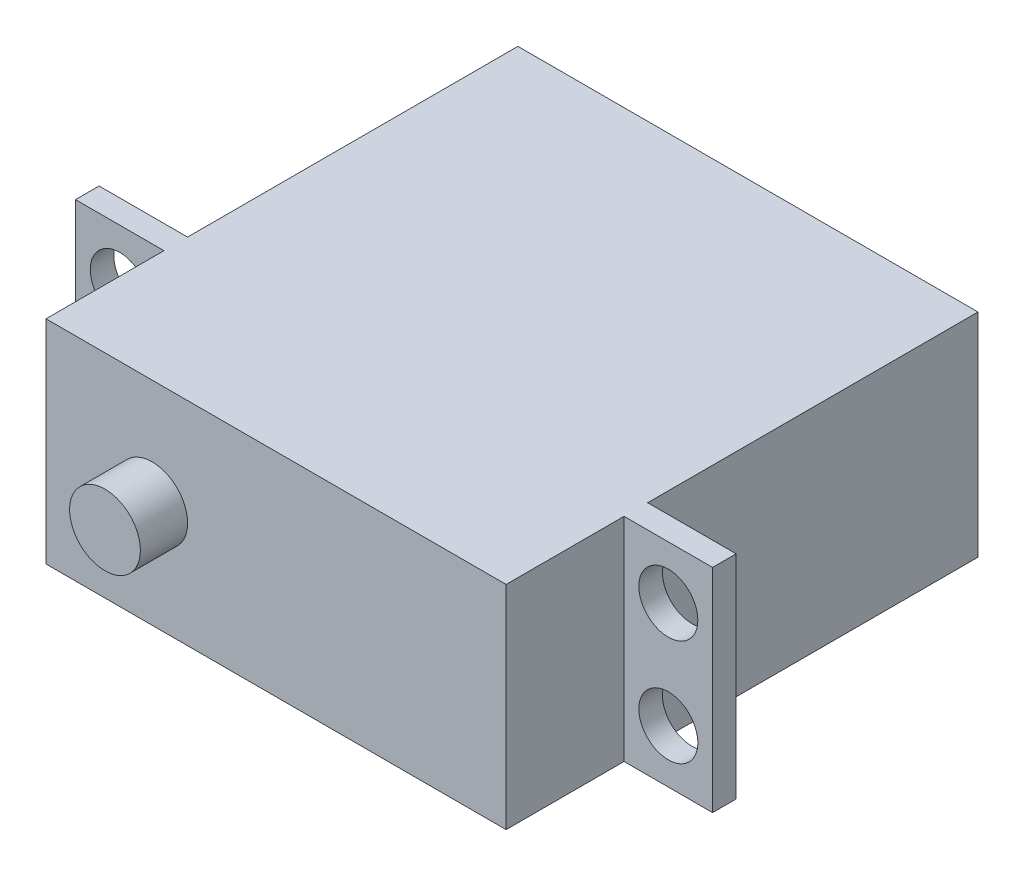
ISO-10303-21;
HEADER;
FILE_DESCRIPTION(('STEP AP214'),'2;1');
FILE_NAME('part.step','',(''),(''),'','','');
FILE_SCHEMA(('AUTOMOTIVE_DESIGN { 1 0 10303 214 1 1 1 1 }'));
ENDSEC;
DATA;
#1=APPLICATION_CONTEXT('core data for automotive mechanical design processes');
#2=APPLICATION_PROTOCOL_DEFINITION('international standard','automotive_design',2000,#1);
#3=PRODUCT_CONTEXT('',#1,'mechanical');
#4=PRODUCT('Part','Part','',(#3));
#5=PRODUCT_RELATED_PRODUCT_CATEGORY('part','',(#4));
#6=PRODUCT_DEFINITION_FORMATION('','',#4);
#7=PRODUCT_DEFINITION_CONTEXT('part definition',#1,'design');
#8=PRODUCT_DEFINITION('design','',#6,#7);
#9=PRODUCT_DEFINITION_SHAPE('','',#8);
#10=(LENGTH_UNIT() NAMED_UNIT(*) SI_UNIT(.MILLI.,.METRE.));
#11=(NAMED_UNIT(*) PLANE_ANGLE_UNIT() SI_UNIT($,.RADIAN.));
#12=(NAMED_UNIT(*) SI_UNIT($,.STERADIAN.) SOLID_ANGLE_UNIT());
#13=UNCERTAINTY_MEASURE_WITH_UNIT(LENGTH_MEASURE(1.E-05),#10,'distance_accuracy_value','');
#14=(GEOMETRIC_REPRESENTATION_CONTEXT(3) GLOBAL_UNCERTAINTY_ASSIGNED_CONTEXT((#13)) GLOBAL_UNIT_ASSIGNED_CONTEXT((#10,
#11,#12)) REPRESENTATION_CONTEXT('',''));
#15=CARTESIAN_POINT('',(0.,0.,0.));
#16=DIRECTION('',(0.,0.,1.));
#17=DIRECTION('',(1.,0.,0.));
#18=AXIS2_PLACEMENT_3D('',#15,#16,#17);
#19=CARTESIAN_POINT('',(0.,0.,0.));
#20=DIRECTION('',(0.,0.,-1.));
#21=DIRECTION('',(-1.,0.,0.));
#22=AXIS2_PLACEMENT_3D('',#19,#20,#21);
#23=PLANE('',#22);
#24=CARTESIAN_POINT('',(-23.25,4.5,0.));
#25=DIRECTION('',(0.,0.,-1.));
#26=DIRECTION('',(-1.,0.,0.));
#27=AXIS2_PLACEMENT_3D('',#24,#25,#26);
#28=CIRCLE('',#27,2.5);
#29=CARTESIAN_POINT('',(-25.75,4.5,0.));
#30=VERTEX_POINT('',#29);
#31=EDGE_CURVE('E272',#30,#30,#28,.T.);
#32=ORIENTED_EDGE('',*,*,#31,.F.);
#33=EDGE_LOOP('',(#32));
#34=FACE_BOUND('',#33,.T.);
#35=CARTESIAN_POINT('',(-23.25,-4.5,0.));
#36=DIRECTION('',(0.,0.,-1.));
#37=DIRECTION('',(-1.,0.,0.));
#38=AXIS2_PLACEMENT_3D('',#35,#36,#37);
#39=CIRCLE('',#38,2.5);
#40=CARTESIAN_POINT('',(-25.75,-4.5,0.));
#41=VERTEX_POINT('',#40);
#42=EDGE_CURVE('E255',#41,#41,#39,.T.);
#43=ORIENTED_EDGE('',*,*,#42,.F.);
#44=EDGE_LOOP('',(#43));
#45=FACE_BOUND('',#44,.T.);
#46=DIRECTION('',(0.,1.,0.));
#47=VECTOR('',#46,1.);
#48=CARTESIAN_POINT('',(-19.5,-9.,0.));
#49=LINE('',#48,#47);
#50=CARTESIAN_POINT('',(-19.5,-9.,0.));
#51=VERTEX_POINT('',#50);
#52=CARTESIAN_POINT('',(-19.5,9.,0.));
#53=VERTEX_POINT('',#52);
#54=EDGE_CURVE('E153',#51,#53,#49,.T.);
#55=ORIENTED_EDGE('',*,*,#54,.F.);
#56=DIRECTION('',(1.,0.,0.));
#57=VECTOR('',#56,1.);
#58=CARTESIAN_POINT('',(-27.,-9.,0.));
#59=LINE('',#58,#57);
#60=CARTESIAN_POINT('',(-27.,-9.,0.));
#61=VERTEX_POINT('',#60);
#62=EDGE_CURVE('E212',#61,#51,#59,.T.);
#63=ORIENTED_EDGE('',*,*,#62,.F.);
#64=DIRECTION('',(0.,-1.,0.));
#65=VECTOR('',#64,1.);
#66=CARTESIAN_POINT('',(-27.,-9.,0.));
#67=LINE('',#66,#65);
#68=CARTESIAN_POINT('',(-27.,9.,0.));
#69=VERTEX_POINT('',#68);
#70=EDGE_CURVE('E230',#69,#61,#67,.T.);
#71=ORIENTED_EDGE('',*,*,#70,.F.);
#72=DIRECTION('',(-1.,0.,0.));
#73=VECTOR('',#72,1.);
#74=CARTESIAN_POINT('',(-27.,9.,0.));
#75=LINE('',#74,#73);
#76=EDGE_CURVE('E56',#53,#69,#75,.T.);
#77=ORIENTED_EDGE('',*,*,#76,.F.);
#78=EDGE_LOOP('',(#55,#63,#71,#77));
#79=FACE_BOUND('',#78,.T.);
#80=ADVANCED_FACE('F38',(#34,#45,#79),#23,.T.);
#81=CARTESIAN_POINT('',(0.,0.,2.));
#82=DIRECTION('',(0.,0.,-1.));
#83=DIRECTION('',(-1.,0.,0.));
#84=AXIS2_PLACEMENT_3D('',#81,#82,#83);
#85=PLANE('',#84);
#86=CARTESIAN_POINT('',(23.25,-4.5,2.));
#87=DIRECTION('',(0.,0.,1.));
#88=DIRECTION('',(-1.,0.,0.));
#89=AXIS2_PLACEMENT_3D('',#86,#87,#88);
#90=CIRCLE('',#89,2.5);
#91=CARTESIAN_POINT('',(20.75,-4.5,2.));
#92=VERTEX_POINT('',#91);
#93=EDGE_CURVE('E257',#92,#92,#90,.T.);
#94=ORIENTED_EDGE('',*,*,#93,.F.);
#95=EDGE_LOOP('',(#94));
#96=FACE_BOUND('',#95,.T.);
#97=CARTESIAN_POINT('',(23.25,4.5,2.));
#98=DIRECTION('',(0.,0.,1.));
#99=DIRECTION('',(1.,0.,0.));
#100=AXIS2_PLACEMENT_3D('',#97,#98,#99);
#101=CIRCLE('',#100,2.5);
#102=CARTESIAN_POINT('',(25.75,4.5,2.));
#103=VERTEX_POINT('',#102);
#104=EDGE_CURVE('E249',#103,#103,#101,.T.);
#105=ORIENTED_EDGE('',*,*,#104,.F.);
#106=EDGE_LOOP('',(#105));
#107=FACE_BOUND('',#106,.T.);
#108=DIRECTION('',(0.,1.,0.));
#109=VECTOR('',#108,1.);
#110=CARTESIAN_POINT('',(19.5,9.,2.));
#111=LINE('',#110,#109);
#112=CARTESIAN_POINT('',(19.5,-9.,2.));
#113=VERTEX_POINT('',#112);
#114=CARTESIAN_POINT('',(19.5,9.,2.));
#115=VERTEX_POINT('',#114);
#116=EDGE_CURVE('E168',#113,#115,#111,.T.);
#117=ORIENTED_EDGE('',*,*,#116,.F.);
#118=DIRECTION('',(1.,0.,0.));
#119=VECTOR('',#118,1.);
#120=CARTESIAN_POINT('',(-27.,-9.,2.));
#121=LINE('',#120,#119);
#122=CARTESIAN_POINT('',(27.,-9.,2.));
#123=VERTEX_POINT('',#122);
#124=EDGE_CURVE('E219',#113,#123,#121,.T.);
#125=ORIENTED_EDGE('',*,*,#124,.T.);
#126=DIRECTION('',(0.,1.,0.));
#127=VECTOR('',#126,1.);
#128=CARTESIAN_POINT('',(27.,-9.,2.));
#129=LINE('',#128,#127);
#130=CARTESIAN_POINT('',(27.,9.,2.));
#131=VERTEX_POINT('',#130);
#132=EDGE_CURVE('E207',#123,#131,#129,.T.);
#133=ORIENTED_EDGE('',*,*,#132,.T.);
#134=DIRECTION('',(-1.,0.,0.));
#135=VECTOR('',#134,1.);
#136=CARTESIAN_POINT('',(-27.,9.,2.));
#137=LINE('',#136,#135);
#138=EDGE_CURVE('E213',#131,#115,#137,.T.);
#139=ORIENTED_EDGE('',*,*,#138,.T.);
#140=EDGE_LOOP('',(#117,#125,#133,#139));
#141=FACE_BOUND('',#140,.T.);
#142=ADVANCED_FACE('F305',(#96,#107,#141),#85,.F.);
#143=CARTESIAN_POINT('',(-23.25,4.5,2.));
#144=DIRECTION('',(0.,0.,1.));
#145=DIRECTION('',(-1.,0.,0.));
#146=AXIS2_PLACEMENT_3D('',#143,#144,#145);
#147=CIRCLE('',#146,2.5);
#148=CARTESIAN_POINT('',(-25.75,4.5,2.));
#149=VERTEX_POINT('',#148);
#150=EDGE_CURVE('E267',#149,#149,#147,.T.);
#151=ORIENTED_EDGE('',*,*,#150,.F.);
#152=EDGE_LOOP('',(#151));
#153=FACE_BOUND('',#152,.T.);
#154=CARTESIAN_POINT('',(-23.25,-4.5,2.));
#155=DIRECTION('',(0.,0.,1.));
#156=DIRECTION('',(1.,0.,0.));
#157=AXIS2_PLACEMENT_3D('',#154,#155,#156);
#158=CIRCLE('',#157,2.5);
#159=CARTESIAN_POINT('',(-20.75,-4.5,2.));
#160=VERTEX_POINT('',#159);
#161=EDGE_CURVE('E263',#160,#160,#158,.T.);
#162=ORIENTED_EDGE('',*,*,#161,.F.);
#163=EDGE_LOOP('',(#162));
#164=FACE_BOUND('',#163,.T.);
#165=DIRECTION('',(0.,-1.,0.));
#166=VECTOR('',#165,1.);
#167=CARTESIAN_POINT('',(-19.5,9.,2.));
#168=LINE('',#167,#166);
#169=CARTESIAN_POINT('',(-19.5,9.,2.));
#170=VERTEX_POINT('',#169);
#171=CARTESIAN_POINT('',(-19.5,-9.,2.));
#172=VERTEX_POINT('',#171);
#173=EDGE_CURVE('E175',#170,#172,#168,.T.);
#174=ORIENTED_EDGE('',*,*,#173,.F.);
#175=CARTESIAN_POINT('',(-27.,9.,2.));
#176=VERTEX_POINT('',#175);
#177=EDGE_CURVE('E211',#170,#176,#137,.T.);
#178=ORIENTED_EDGE('',*,*,#177,.T.);
#179=DIRECTION('',(0.,-1.,0.));
#180=VECTOR('',#179,1.);
#181=CARTESIAN_POINT('',(-27.,-9.,2.));
#182=LINE('',#181,#180);
#183=CARTESIAN_POINT('',(-27.,-9.,2.));
#184=VERTEX_POINT('',#183);
#185=EDGE_CURVE('E216',#176,#184,#182,.T.);
#186=ORIENTED_EDGE('',*,*,#185,.T.);
#187=EDGE_CURVE('E220',#184,#172,#121,.T.);
#188=ORIENTED_EDGE('',*,*,#187,.T.);
#189=EDGE_LOOP('',(#174,#178,#186,#188));
#190=FACE_BOUND('',#189,.T.);
#191=ADVANCED_FACE('F313',(#153,#164,#190),#85,.F.);
#192=CARTESIAN_POINT('',(27.,-9.,2.));
#193=DIRECTION('',(-1.,0.,0.));
#194=DIRECTION('',(0.,0.,1.));
#195=AXIS2_PLACEMENT_3D('',#192,#193,#194);
#196=PLANE('',#195);
#197=DIRECTION('',(0.,1.,0.));
#198=VECTOR('',#197,1.);
#199=CARTESIAN_POINT('',(27.,-9.,0.));
#200=LINE('',#199,#198);
#201=CARTESIAN_POINT('',(27.,-9.,0.));
#202=VERTEX_POINT('',#201);
#203=CARTESIAN_POINT('',(27.,9.,0.));
#204=VERTEX_POINT('',#203);
#205=EDGE_CURVE('E206',#202,#204,#200,.T.);
#206=ORIENTED_EDGE('',*,*,#205,.T.);
#207=DIRECTION('',(0.,0.,-1.));
#208=VECTOR('',#207,1.);
#209=CARTESIAN_POINT('',(27.,9.,2.));
#210=LINE('',#209,#208);
#211=EDGE_CURVE('E11',#131,#204,#210,.T.);
#212=ORIENTED_EDGE('',*,*,#211,.F.);
#213=ORIENTED_EDGE('',*,*,#132,.F.);
#214=DIRECTION('',(0.,0.,-1.));
#215=VECTOR('',#214,1.);
#216=CARTESIAN_POINT('',(27.,-9.,2.));
#217=LINE('',#216,#215);
#218=EDGE_CURVE('E223',#123,#202,#217,.T.);
#219=ORIENTED_EDGE('',*,*,#218,.T.);
#220=EDGE_LOOP('',(#206,#212,#213,#219));
#221=FACE_BOUND('',#220,.T.);
#222=ADVANCED_FACE('F40',(#221),#196,.F.);
#223=CARTESIAN_POINT('',(-27.,9.,2.));
#224=DIRECTION('',(0.,-1.,0.));
#225=DIRECTION('',(0.,0.,-1.));
#226=AXIS2_PLACEMENT_3D('',#223,#224,#225);
#227=PLANE('',#226);
#228=CARTESIAN_POINT('',(19.5,9.,0.));
#229=VERTEX_POINT('',#228);
#230=EDGE_CURVE('E227',#204,#229,#75,.T.);
#231=ORIENTED_EDGE('',*,*,#230,.T.);
#232=DIRECTION('',(0.,0.,1.));
#233=VECTOR('',#232,1.);
#234=CARTESIAN_POINT('',(19.5,9.,-28.));
#235=LINE('',#234,#233);
#236=CARTESIAN_POINT('',(19.5,9.,-28.));
#237=VERTEX_POINT('',#236);
#238=EDGE_CURVE('E136',#237,#229,#235,.T.);
#239=ORIENTED_EDGE('',*,*,#238,.F.);
#240=DIRECTION('',(1.,0.,0.));
#241=VECTOR('',#240,1.);
#242=CARTESIAN_POINT('',(19.5,9.,-28.));
#243=LINE('',#242,#241);
#244=CARTESIAN_POINT('',(-19.5,9.,-28.));
#245=VERTEX_POINT('',#244);
#246=EDGE_CURVE('E129',#245,#237,#243,.T.);
#247=ORIENTED_EDGE('',*,*,#246,.F.);
#248=DIRECTION('',(0.,0.,1.));
#249=VECTOR('',#248,1.);
#250=CARTESIAN_POINT('',(-19.5,9.,-28.));
#251=LINE('',#250,#249);
#252=EDGE_CURVE('E133',#245,#53,#251,.T.);
#253=ORIENTED_EDGE('',*,*,#252,.T.);
#254=ORIENTED_EDGE('',*,*,#76,.T.);
#255=DIRECTION('',(0.,0.,-1.));
#256=VECTOR('',#255,1.);
#257=CARTESIAN_POINT('',(-27.,9.,2.));
#258=LINE('',#257,#256);
#259=EDGE_CURVE('E48',#176,#69,#258,.T.);
#260=ORIENTED_EDGE('',*,*,#259,.F.);
#261=ORIENTED_EDGE('',*,*,#177,.F.);
#262=DIRECTION('',(0.,0.,-1.));
#263=VECTOR('',#262,1.);
#264=CARTESIAN_POINT('',(-19.5,9.,12.));
#265=LINE('',#264,#263);
#266=CARTESIAN_POINT('',(-19.5,9.,12.));
#267=VERTEX_POINT('',#266);
#268=EDGE_CURVE('E198',#267,#170,#265,.T.);
#269=ORIENTED_EDGE('',*,*,#268,.F.);
#270=DIRECTION('',(-1.,0.,0.));
#271=VECTOR('',#270,1.);
#272=CARTESIAN_POINT('',(-19.5,9.,12.));
#273=LINE('',#272,#271);
#274=CARTESIAN_POINT('',(19.5,9.,12.));
#275=VERTEX_POINT('',#274);
#276=EDGE_CURVE('E174',#275,#267,#273,.T.);
#277=ORIENTED_EDGE('',*,*,#276,.F.);
#278=DIRECTION('',(0.,0.,-1.));
#279=VECTOR('',#278,1.);
#280=CARTESIAN_POINT('',(19.5,9.,12.));
#281=LINE('',#280,#279);
#282=EDGE_CURVE('E202',#275,#115,#281,.T.);
#283=ORIENTED_EDGE('',*,*,#282,.T.);
#284=ORIENTED_EDGE('',*,*,#138,.F.);
#285=ORIENTED_EDGE('',*,*,#211,.T.);
#286=EDGE_LOOP('',(#231,#239,#247,#253,#254,#260,#261,#269,#277,#283,#284,#285));
#287=FACE_BOUND('',#286,.T.);
#288=ADVANCED_FACE('F131',(#287),#227,.F.);
#289=CARTESIAN_POINT('',(-27.,-9.,2.));
#290=DIRECTION('',(1.,0.,0.));
#291=DIRECTION('',(0.,0.,-1.));
#292=AXIS2_PLACEMENT_3D('',#289,#290,#291);
#293=PLANE('',#292);
#294=ORIENTED_EDGE('',*,*,#70,.T.);
#295=DIRECTION('',(0.,0.,-1.));
#296=VECTOR('',#295,1.);
#297=CARTESIAN_POINT('',(-27.,-9.,2.));
#298=LINE('',#297,#296);
#299=EDGE_CURVE('E240',#184,#61,#298,.T.);
#300=ORIENTED_EDGE('',*,*,#299,.F.);
#301=ORIENTED_EDGE('',*,*,#185,.F.);
#302=ORIENTED_EDGE('',*,*,#259,.T.);
#303=EDGE_LOOP('',(#294,#300,#301,#302));
#304=FACE_BOUND('',#303,.T.);
#305=ADVANCED_FACE('F331',(#304),#293,.F.);
#306=CARTESIAN_POINT('',(-27.,-9.,2.));
#307=DIRECTION('',(0.,1.,0.));
#308=DIRECTION('',(0.,0.,1.));
#309=AXIS2_PLACEMENT_3D('',#306,#307,#308);
#310=PLANE('',#309);
#311=ORIENTED_EDGE('',*,*,#62,.T.);
#312=DIRECTION('',(0.,0.,1.));
#313=VECTOR('',#312,1.);
#314=CARTESIAN_POINT('',(-19.5,-9.,-28.));
#315=LINE('',#314,#313);
#316=CARTESIAN_POINT('',(-19.5,-9.,-28.));
#317=VERTEX_POINT('',#316);
#318=EDGE_CURVE('E280',#317,#51,#315,.T.);
#319=ORIENTED_EDGE('',*,*,#318,.F.);
#320=DIRECTION('',(-1.,0.,0.));
#321=VECTOR('',#320,1.);
#322=CARTESIAN_POINT('',(19.5,-9.,-28.));
#323=LINE('',#322,#321);
#324=CARTESIAN_POINT('',(19.5,-9.,-28.));
#325=VERTEX_POINT('',#324);
#326=EDGE_CURVE('E146',#325,#317,#323,.T.);
#327=ORIENTED_EDGE('',*,*,#326,.F.);
#328=DIRECTION('',(0.,0.,1.));
#329=VECTOR('',#328,1.);
#330=CARTESIAN_POINT('',(19.5,-9.,-28.));
#331=LINE('',#330,#329);
#332=CARTESIAN_POINT('',(19.5,-9.,0.));
#333=VERTEX_POINT('',#332);
#334=EDGE_CURVE('E162',#325,#333,#331,.T.);
#335=ORIENTED_EDGE('',*,*,#334,.T.);
#336=EDGE_CURVE('E233',#333,#202,#59,.T.);
#337=ORIENTED_EDGE('',*,*,#336,.T.);
#338=ORIENTED_EDGE('',*,*,#218,.F.);
#339=ORIENTED_EDGE('',*,*,#124,.F.);
#340=DIRECTION('',(0.,0.,-1.));
#341=VECTOR('',#340,1.);
#342=CARTESIAN_POINT('',(19.5,-9.,12.));
#343=LINE('',#342,#341);
#344=CARTESIAN_POINT('',(19.5,-9.,12.));
#345=VERTEX_POINT('',#344);
#346=EDGE_CURVE('E184',#345,#113,#343,.T.);
#347=ORIENTED_EDGE('',*,*,#346,.F.);
#348=DIRECTION('',(1.,0.,0.));
#349=VECTOR('',#348,1.);
#350=CARTESIAN_POINT('',(-19.5,-9.,12.));
#351=LINE('',#350,#349);
#352=CARTESIAN_POINT('',(-19.5,-9.,12.));
#353=VERTEX_POINT('',#352);
#354=EDGE_CURVE('E181',#353,#345,#351,.T.);
#355=ORIENTED_EDGE('',*,*,#354,.F.);
#356=DIRECTION('',(0.,0.,-1.));
#357=VECTOR('',#356,1.);
#358=CARTESIAN_POINT('',(-19.5,-9.,12.));
#359=LINE('',#358,#357);
#360=EDGE_CURVE('E194',#353,#172,#359,.T.);
#361=ORIENTED_EDGE('',*,*,#360,.T.);
#362=ORIENTED_EDGE('',*,*,#187,.F.);
#363=ORIENTED_EDGE('',*,*,#299,.T.);
#364=EDGE_LOOP('',(#311,#319,#327,#335,#337,#338,#339,#347,#355,#361,#362,#363));
#365=FACE_BOUND('',#364,.T.);
#366=ADVANCED_FACE('F290',(#365),#310,.F.);
#367=CARTESIAN_POINT('',(23.25,-4.5,0.));
#368=DIRECTION('',(0.,0.,-1.));
#369=DIRECTION('',(-1.,0.,0.));
#370=AXIS2_PLACEMENT_3D('',#367,#368,#369);
#371=CIRCLE('',#370,2.5);
#372=CARTESIAN_POINT('',(20.75,-4.5,0.));
#373=VERTEX_POINT('',#372);
#374=EDGE_CURVE('E42',#373,#373,#371,.T.);
#375=ORIENTED_EDGE('',*,*,#374,.F.);
#376=EDGE_LOOP('',(#375));
#377=FACE_BOUND('',#376,.T.);
#378=CARTESIAN_POINT('',(23.25,4.5,0.));
#379=DIRECTION('',(0.,0.,-1.));
#380=DIRECTION('',(-1.,0.,0.));
#381=AXIS2_PLACEMENT_3D('',#378,#379,#380);
#382=CIRCLE('',#381,2.5);
#383=CARTESIAN_POINT('',(20.75,4.5,0.));
#384=VERTEX_POINT('',#383);
#385=EDGE_CURVE('E246',#384,#384,#382,.T.);
#386=ORIENTED_EDGE('',*,*,#385,.F.);
#387=EDGE_LOOP('',(#386));
#388=FACE_BOUND('',#387,.T.);
#389=DIRECTION('',(0.,-1.,0.));
#390=VECTOR('',#389,1.);
#391=CARTESIAN_POINT('',(19.5,-9.,0.));
#392=LINE('',#391,#390);
#393=EDGE_CURVE('E64',#229,#333,#392,.T.);
#394=ORIENTED_EDGE('',*,*,#393,.F.);
#395=ORIENTED_EDGE('',*,*,#230,.F.);
#396=ORIENTED_EDGE('',*,*,#205,.F.);
#397=ORIENTED_EDGE('',*,*,#336,.F.);
#398=EDGE_LOOP('',(#394,#395,#396,#397));
#399=FACE_BOUND('',#398,.T.);
#400=ADVANCED_FACE('F308',(#377,#388,#399),#23,.T.);
#401=CARTESIAN_POINT('',(19.5,9.,12.));
#402=DIRECTION('',(-1.,0.,0.));
#403=DIRECTION('',(0.,0.,1.));
#404=AXIS2_PLACEMENT_3D('',#401,#402,#403);
#405=PLANE('',#404);
#406=ORIENTED_EDGE('',*,*,#116,.T.);
#407=ORIENTED_EDGE('',*,*,#282,.F.);
#408=DIRECTION('',(0.,1.,0.));
#409=VECTOR('',#408,1.);
#410=CARTESIAN_POINT('',(19.5,9.,12.));
#411=LINE('',#410,#409);
#412=EDGE_CURVE('E170',#345,#275,#411,.T.);
#413=ORIENTED_EDGE('',*,*,#412,.F.);
#414=ORIENTED_EDGE('',*,*,#346,.T.);
#415=EDGE_LOOP('',(#406,#407,#413,#414));
#416=FACE_BOUND('',#415,.T.);
#417=ADVANCED_FACE('F320',(#416),#405,.F.);
#418=CARTESIAN_POINT('',(-19.5,9.,12.));
#419=DIRECTION('',(1.,0.,0.));
#420=DIRECTION('',(0.,0.,-1.));
#421=AXIS2_PLACEMENT_3D('',#418,#419,#420);
#422=PLANE('',#421);
#423=ORIENTED_EDGE('',*,*,#173,.T.);
#424=ORIENTED_EDGE('',*,*,#360,.F.);
#425=DIRECTION('',(0.,-1.,0.));
#426=VECTOR('',#425,1.);
#427=CARTESIAN_POINT('',(-19.5,9.,12.));
#428=LINE('',#427,#426);
#429=EDGE_CURVE('E178',#267,#353,#428,.T.);
#430=ORIENTED_EDGE('',*,*,#429,.F.);
#431=ORIENTED_EDGE('',*,*,#268,.T.);
#432=EDGE_LOOP('',(#423,#424,#430,#431));
#433=FACE_BOUND('',#432,.T.);
#434=ADVANCED_FACE('F327',(#433),#422,.F.);
#435=CARTESIAN_POINT('',(0.,0.,12.));
#436=DIRECTION('',(0.,0.,1.));
#437=DIRECTION('',(1.,0.,0.));
#438=AXIS2_PLACEMENT_3D('',#435,#436,#437);
#439=PLANE('',#438);
#440=CARTESIAN_POINT('',(-10.5,0.,12.));
#441=DIRECTION('',(0.,0.,1.));
#442=DIRECTION('',(1.,0.,0.));
#443=AXIS2_PLACEMENT_3D('',#440,#441,#442);
#444=CIRCLE('',#443,3.);
#445=CARTESIAN_POINT('',(-7.5,0.,12.));
#446=VERTEX_POINT('',#445);
#447=EDGE_CURVE('E155',#446,#446,#444,.T.);
#448=ORIENTED_EDGE('',*,*,#447,.F.);
#449=EDGE_LOOP('',(#448));
#450=FACE_BOUND('',#449,.T.);
#451=ORIENTED_EDGE('',*,*,#412,.T.);
#452=ORIENTED_EDGE('',*,*,#276,.T.);
#453=ORIENTED_EDGE('',*,*,#429,.T.);
#454=ORIENTED_EDGE('',*,*,#354,.T.);
#455=EDGE_LOOP('',(#451,#452,#453,#454));
#456=FACE_BOUND('',#455,.T.);
#457=ADVANCED_FACE('F351',(#450,#456),#439,.T.);
#458=CARTESIAN_POINT('',(-10.5,0.,16.));
#459=DIRECTION('',(0.,0.,-1.));
#460=DIRECTION('',(-1.,0.,0.));
#461=AXIS2_PLACEMENT_3D('',#458,#459,#460);
#462=CYLINDRICAL_SURFACE('',#461,3.);
#463=CARTESIAN_POINT('',(-10.5,0.,16.));
#464=DIRECTION('',(0.,0.,1.));
#465=DIRECTION('',(1.,0.,0.));
#466=AXIS2_PLACEMENT_3D('',#463,#464,#465);
#467=CIRCLE('',#466,3.);
#468=CARTESIAN_POINT('',(-7.5,0.,16.));
#469=VERTEX_POINT('',#468);
#470=EDGE_CURVE('E160',#469,#469,#467,.T.);
#471=ORIENTED_EDGE('',*,*,#470,.F.);
#472=EDGE_LOOP('',(#471));
#473=FACE_BOUND('',#472,.T.);
#474=ORIENTED_EDGE('',*,*,#447,.T.);
#475=EDGE_LOOP('',(#474));
#476=FACE_BOUND('',#475,.T.);
#477=ADVANCED_FACE('F391',(#473,#476),#462,.T.);
#478=CARTESIAN_POINT('',(-10.5,0.,16.));
#479=DIRECTION('',(0.,0.,1.));
#480=DIRECTION('',(1.,0.,0.));
#481=AXIS2_PLACEMENT_3D('',#478,#479,#480);
#482=PLANE('',#481);
#483=ORIENTED_EDGE('',*,*,#470,.T.);
#484=EDGE_LOOP('',(#483));
#485=FACE_BOUND('',#484,.T.);
#486=ADVANCED_FACE('F302',(#485),#482,.T.);
#487=CARTESIAN_POINT('',(-19.5,-9.,-28.));
#488=DIRECTION('',(1.,0.,0.));
#489=DIRECTION('',(0.,0.,-1.));
#490=AXIS2_PLACEMENT_3D('',#487,#488,#489);
#491=PLANE('',#490);
#492=ORIENTED_EDGE('',*,*,#54,.T.);
#493=ORIENTED_EDGE('',*,*,#252,.F.);
#494=DIRECTION('',(0.,1.,0.));
#495=VECTOR('',#494,1.);
#496=CARTESIAN_POINT('',(-19.5,-9.,-28.));
#497=LINE('',#496,#495);
#498=EDGE_CURVE('E141',#317,#245,#497,.T.);
#499=ORIENTED_EDGE('',*,*,#498,.F.);
#500=ORIENTED_EDGE('',*,*,#318,.T.);
#501=EDGE_LOOP('',(#492,#493,#499,#500));
#502=FACE_BOUND('',#501,.T.);
#503=ADVANCED_FACE('F152',(#502),#491,.F.);
#504=CARTESIAN_POINT('',(19.5,-9.,-28.));
#505=DIRECTION('',(-1.,0.,0.));
#506=DIRECTION('',(0.,0.,1.));
#507=AXIS2_PLACEMENT_3D('',#504,#505,#506);
#508=PLANE('',#507);
#509=ORIENTED_EDGE('',*,*,#393,.T.);
#510=ORIENTED_EDGE('',*,*,#334,.F.);
#511=DIRECTION('',(0.,-1.,0.));
#512=VECTOR('',#511,1.);
#513=CARTESIAN_POINT('',(19.5,-9.,-28.));
#514=LINE('',#513,#512);
#515=EDGE_CURVE('E140',#237,#325,#514,.T.);
#516=ORIENTED_EDGE('',*,*,#515,.F.);
#517=ORIENTED_EDGE('',*,*,#238,.T.);
#518=EDGE_LOOP('',(#509,#510,#516,#517));
#519=FACE_BOUND('',#518,.T.);
#520=ADVANCED_FACE('F293',(#519),#508,.F.);
#521=CARTESIAN_POINT('',(0.,0.,-28.));
#522=DIRECTION('',(0.,0.,1.));
#523=DIRECTION('',(1.,0.,0.));
#524=AXIS2_PLACEMENT_3D('',#521,#522,#523);
#525=PLANE('',#524);
#526=ORIENTED_EDGE('',*,*,#498,.T.);
#527=ORIENTED_EDGE('',*,*,#246,.T.);
#528=ORIENTED_EDGE('',*,*,#515,.T.);
#529=ORIENTED_EDGE('',*,*,#326,.T.);
#530=EDGE_LOOP('',(#526,#527,#528,#529));
#531=FACE_BOUND('',#530,.T.);
#532=ADVANCED_FACE('F144',(#531),#525,.F.);
#533=CARTESIAN_POINT('',(23.25,4.5,-28.));
#534=DIRECTION('',(0.,0.,1.));
#535=DIRECTION('',(1.,0.,0.));
#536=AXIS2_PLACEMENT_3D('',#533,#534,#535);
#537=CYLINDRICAL_SURFACE('',#536,2.5);
#538=ORIENTED_EDGE('',*,*,#385,.T.);
#539=EDGE_LOOP('',(#538));
#540=FACE_BOUND('',#539,.T.);
#541=ORIENTED_EDGE('',*,*,#104,.T.);
#542=EDGE_LOOP('',(#541));
#543=FACE_BOUND('',#542,.T.);
#544=ADVANCED_FACE('F300',(#540,#543),#537,.F.);
#545=CARTESIAN_POINT('',(23.25,-4.5,-28.));
#546=DIRECTION('',(0.,0.,1.));
#547=DIRECTION('',(1.,0.,0.));
#548=AXIS2_PLACEMENT_3D('',#545,#546,#547);
#549=CYLINDRICAL_SURFACE('',#548,2.5);
#550=ORIENTED_EDGE('',*,*,#374,.T.);
#551=EDGE_LOOP('',(#550));
#552=FACE_BOUND('',#551,.T.);
#553=ORIENTED_EDGE('',*,*,#93,.T.);
#554=EDGE_LOOP('',(#553));
#555=FACE_BOUND('',#554,.T.);
#556=ADVANCED_FACE('F335',(#552,#555),#549,.F.);
#557=CARTESIAN_POINT('',(-23.25,-4.5,-28.));
#558=DIRECTION('',(0.,0.,1.));
#559=DIRECTION('',(1.,0.,0.));
#560=AXIS2_PLACEMENT_3D('',#557,#558,#559);
#561=CYLINDRICAL_SURFACE('',#560,2.5);
#562=ORIENTED_EDGE('',*,*,#42,.T.);
#563=EDGE_LOOP('',(#562));
#564=FACE_BOUND('',#563,.T.);
#565=ORIENTED_EDGE('',*,*,#161,.T.);
#566=EDGE_LOOP('',(#565));
#567=FACE_BOUND('',#566,.T.);
#568=ADVANCED_FACE('F338',(#564,#567),#561,.F.);
#569=CARTESIAN_POINT('',(-23.25,4.5,-28.));
#570=DIRECTION('',(0.,0.,1.));
#571=DIRECTION('',(1.,0.,0.));
#572=AXIS2_PLACEMENT_3D('',#569,#570,#571);
#573=CYLINDRICAL_SURFACE('',#572,2.5);
#574=ORIENTED_EDGE('',*,*,#31,.T.);
#575=EDGE_LOOP('',(#574));
#576=FACE_BOUND('',#575,.T.);
#577=ORIENTED_EDGE('',*,*,#150,.T.);
#578=EDGE_LOOP('',(#577));
#579=FACE_BOUND('',#578,.T.);
#580=ADVANCED_FACE('F462',(#576,#579),#573,.F.);
#581=CLOSED_SHELL('',(#80,#142,#191,#222,#288,#305,#366,#400,#417,#434,#457,#477,#486,#503,#520,
#532,#544,#556,#568,#580));
#582=MANIFOLD_SOLID_BREP('B2',#581);
#583=ADVANCED_BREP_SHAPE_REPRESENTATION('',(#18,#582),#14);
#584=SHAPE_DEFINITION_REPRESENTATION(#9,#583);
ENDSEC;
END-ISO-10303-21;
